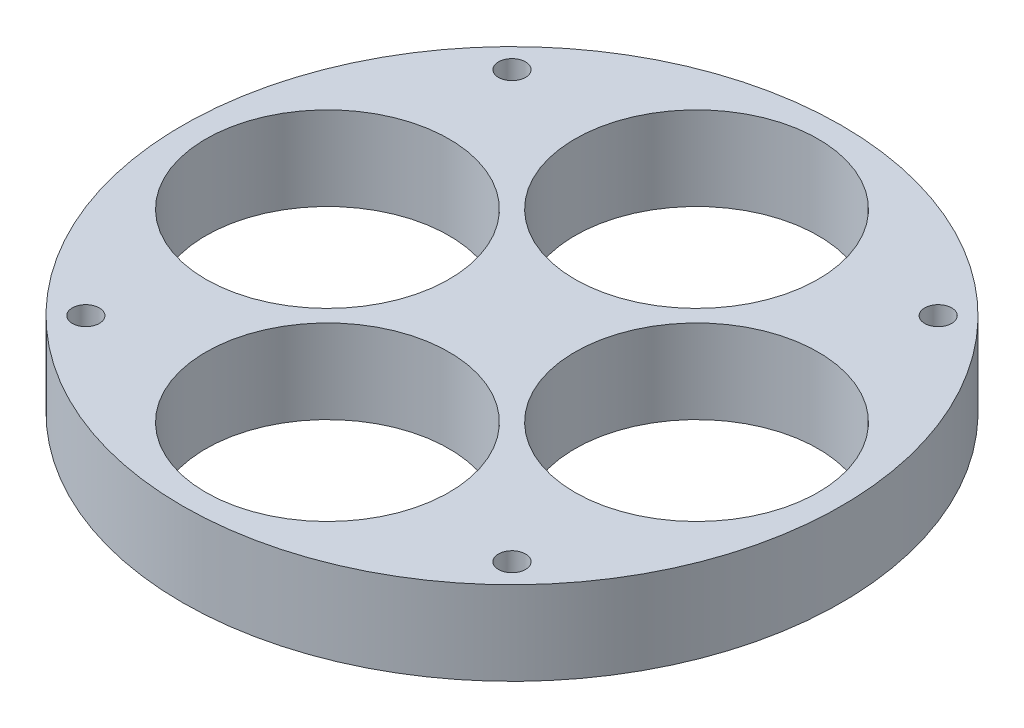
ISO-10303-21;
HEADER;
FILE_DESCRIPTION(('STEP AP214'),'2;1');
FILE_NAME('part.step','',(''),(''),'','','');
FILE_SCHEMA(('AUTOMOTIVE_DESIGN { 1 0 10303 214 1 1 1 1 }'));
ENDSEC;
DATA;
#1=APPLICATION_CONTEXT('core data for automotive mechanical design processes');
#2=APPLICATION_PROTOCOL_DEFINITION('international standard','automotive_design',2000,#1);
#3=PRODUCT_CONTEXT('',#1,'mechanical');
#4=PRODUCT('Part','Part','',(#3));
#5=PRODUCT_RELATED_PRODUCT_CATEGORY('part','',(#4));
#6=PRODUCT_DEFINITION_FORMATION('','',#4);
#7=PRODUCT_DEFINITION_CONTEXT('part definition',#1,'design');
#8=PRODUCT_DEFINITION('design','',#6,#7);
#9=PRODUCT_DEFINITION_SHAPE('','',#8);
#10=(LENGTH_UNIT() NAMED_UNIT(*) SI_UNIT(.MILLI.,.METRE.));
#11=(NAMED_UNIT(*) PLANE_ANGLE_UNIT() SI_UNIT($,.RADIAN.));
#12=(NAMED_UNIT(*) SI_UNIT($,.STERADIAN.) SOLID_ANGLE_UNIT());
#13=UNCERTAINTY_MEASURE_WITH_UNIT(LENGTH_MEASURE(1.E-05),#10,'distance_accuracy_value','');
#14=(GEOMETRIC_REPRESENTATION_CONTEXT(3) GLOBAL_UNCERTAINTY_ASSIGNED_CONTEXT((#13)) GLOBAL_UNIT_ASSIGNED_CONTEXT((#10,
#11,#12)) REPRESENTATION_CONTEXT('',''));
#15=CARTESIAN_POINT('',(0.,0.,0.));
#16=DIRECTION('',(0.,0.,1.));
#17=DIRECTION('',(1.,0.,0.));
#18=AXIS2_PLACEMENT_3D('',#15,#16,#17);
#19=CARTESIAN_POINT('',(16.1644610179254,6.35,16.1644610179245));
#20=DIRECTION('',(0.,-1.,0.));
#21=DIRECTION('',(0.,0.,-1.));
#22=AXIS2_PLACEMENT_3D('',#19,#20,#21);
#23=CYLINDRICAL_SURFACE('',#22,1.02499999999977);
#24=CARTESIAN_POINT('',(16.1644610179254,6.35,16.1644610179245));
#25=DIRECTION('',(0.,1.,0.));
#26=DIRECTION('',(0.,0.,1.));
#27=AXIS2_PLACEMENT_3D('',#24,#25,#26);
#28=CIRCLE('',#27,1.02499999999977);
#29=CARTESIAN_POINT('',(16.1644610179254,6.35,17.1894610179242));
#30=VERTEX_POINT('',#29);
#31=EDGE_CURVE('E41',#30,#30,#28,.T.);
#32=ORIENTED_EDGE('',*,*,#31,.T.);
#33=EDGE_LOOP('',(#32));
#34=FACE_BOUND('',#33,.T.);
#35=CARTESIAN_POINT('',(16.1644610179254,0.,16.1644610179245));
#36=DIRECTION('',(0.,1.,0.));
#37=DIRECTION('',(0.,0.,1.));
#38=AXIS2_PLACEMENT_3D('',#35,#36,#37);
#39=CIRCLE('',#38,1.02499999999977);
#40=CARTESIAN_POINT('',(16.1644610179254,0.,17.1894610179242));
#41=VERTEX_POINT('',#40);
#42=EDGE_CURVE('E70',#41,#41,#39,.T.);
#43=ORIENTED_EDGE('',*,*,#42,.F.);
#44=EDGE_LOOP('',(#43));
#45=FACE_BOUND('',#44,.T.);
#46=ADVANCED_FACE('F33',(#34,#45),#23,.F.);
#47=CARTESIAN_POINT('',(-16.1644610179236,6.35,16.1644610179254));
#48=DIRECTION('',(0.,-1.,0.));
#49=DIRECTION('',(0.,0.,-1.));
#50=AXIS2_PLACEMENT_3D('',#47,#48,#49);
#51=CYLINDRICAL_SURFACE('',#50,1.02500000000068);
#52=CARTESIAN_POINT('',(-16.1644610179236,6.35,16.1644610179254));
#53=DIRECTION('',(0.,1.,0.));
#54=DIRECTION('',(0.,0.,1.));
#55=AXIS2_PLACEMENT_3D('',#52,#53,#54);
#56=CIRCLE('',#55,1.02500000000068);
#57=CARTESIAN_POINT('',(-16.1644610179236,6.35,17.1894610179261));
#58=VERTEX_POINT('',#57);
#59=EDGE_CURVE('E46',#58,#58,#56,.T.);
#60=ORIENTED_EDGE('',*,*,#59,.T.);
#61=EDGE_LOOP('',(#60));
#62=FACE_BOUND('',#61,.T.);
#63=CARTESIAN_POINT('',(-16.1644610179236,0.,16.1644610179254));
#64=DIRECTION('',(0.,1.,0.));
#65=DIRECTION('',(0.,0.,1.));
#66=AXIS2_PLACEMENT_3D('',#63,#64,#65);
#67=CIRCLE('',#66,1.02500000000068);
#68=CARTESIAN_POINT('',(-16.1644610179236,0.,17.1894610179261));
#69=VERTEX_POINT('',#68);
#70=EDGE_CURVE('E68',#69,#69,#67,.T.);
#71=ORIENTED_EDGE('',*,*,#70,.F.);
#72=EDGE_LOOP('',(#71));
#73=FACE_BOUND('',#72,.T.);
#74=ADVANCED_FACE('F100',(#62,#73),#51,.F.);
#75=CARTESIAN_POINT('',(-16.1644610179245,6.35,-16.1644610179236));
#76=DIRECTION('',(0.,-1.,0.));
#77=DIRECTION('',(0.,0.,-1.));
#78=AXIS2_PLACEMENT_3D('',#75,#76,#77);
#79=CYLINDRICAL_SURFACE('',#78,1.02500000000097);
#80=CARTESIAN_POINT('',(-16.1644610179245,6.35,-16.1644610179236));
#81=DIRECTION('',(0.,1.,0.));
#82=DIRECTION('',(0.,0.,1.));
#83=AXIS2_PLACEMENT_3D('',#80,#81,#82);
#84=CIRCLE('',#83,1.02500000000097);
#85=CARTESIAN_POINT('',(-16.1644610179245,6.35,-15.1394610179226));
#86=VERTEX_POINT('',#85);
#87=EDGE_CURVE('E95',#86,#86,#84,.T.);
#88=ORIENTED_EDGE('',*,*,#87,.T.);
#89=EDGE_LOOP('',(#88));
#90=FACE_BOUND('',#89,.T.);
#91=CARTESIAN_POINT('',(-16.1644610179245,0.,-16.1644610179236));
#92=DIRECTION('',(0.,1.,0.));
#93=DIRECTION('',(0.,0.,1.));
#94=AXIS2_PLACEMENT_3D('',#91,#92,#93);
#95=CIRCLE('',#94,1.02500000000097);
#96=CARTESIAN_POINT('',(-16.1644610179245,0.,-15.1394610179226));
#97=VERTEX_POINT('',#96);
#98=EDGE_CURVE('E65',#97,#97,#95,.T.);
#99=ORIENTED_EDGE('',*,*,#98,.F.);
#100=EDGE_LOOP('',(#99));
#101=FACE_BOUND('',#100,.T.);
#102=ADVANCED_FACE('F118',(#90,#101),#79,.F.);
#103=CARTESIAN_POINT('',(0.,6.35,14.));
#104=DIRECTION('',(0.,-1.,0.));
#105=DIRECTION('',(0.,0.,-1.));
#106=AXIS2_PLACEMENT_3D('',#103,#104,#105);
#107=CYLINDRICAL_SURFACE('',#106,9.22500000000001);
#108=CARTESIAN_POINT('',(0.,6.35,14.));
#109=DIRECTION('',(0.,1.,0.));
#110=DIRECTION('',(0.,0.,1.));
#111=AXIS2_PLACEMENT_3D('',#108,#109,#110);
#112=CIRCLE('',#111,9.22500000000001);
#113=CARTESIAN_POINT('',(0.,6.35,23.225));
#114=VERTEX_POINT('',#113);
#115=EDGE_CURVE('E92',#114,#114,#112,.T.);
#116=ORIENTED_EDGE('',*,*,#115,.T.);
#117=EDGE_LOOP('',(#116));
#118=FACE_BOUND('',#117,.T.);
#119=CARTESIAN_POINT('',(0.,0.,14.));
#120=DIRECTION('',(0.,1.,0.));
#121=DIRECTION('',(0.,0.,1.));
#122=AXIS2_PLACEMENT_3D('',#119,#120,#121);
#123=CIRCLE('',#122,9.22500000000001);
#124=CARTESIAN_POINT('',(0.,0.,23.225));
#125=VERTEX_POINT('',#124);
#126=EDGE_CURVE('E62',#125,#125,#123,.T.);
#127=ORIENTED_EDGE('',*,*,#126,.F.);
#128=EDGE_LOOP('',(#127));
#129=FACE_BOUND('',#128,.T.);
#130=ADVANCED_FACE('F125',(#118,#129),#107,.F.);
#131=CARTESIAN_POINT('',(-14.,6.35,0.));
#132=DIRECTION('',(0.,-1.,0.));
#133=DIRECTION('',(0.,0.,-1.));
#134=AXIS2_PLACEMENT_3D('',#131,#132,#133);
#135=CYLINDRICAL_SURFACE('',#134,9.22500000000001);
#136=CARTESIAN_POINT('',(-14.,6.35,0.));
#137=DIRECTION('',(0.,1.,0.));
#138=DIRECTION('',(0.,0.,1.));
#139=AXIS2_PLACEMENT_3D('',#136,#137,#138);
#140=CIRCLE('',#139,9.22500000000001);
#141=CARTESIAN_POINT('',(-14.,6.35,9.22499999999991));
#142=VERTEX_POINT('',#141);
#143=EDGE_CURVE('E89',#142,#142,#140,.T.);
#144=ORIENTED_EDGE('',*,*,#143,.T.);
#145=EDGE_LOOP('',(#144));
#146=FACE_BOUND('',#145,.T.);
#147=CARTESIAN_POINT('',(-14.,0.,0.));
#148=DIRECTION('',(0.,1.,0.));
#149=DIRECTION('',(0.,0.,1.));
#150=AXIS2_PLACEMENT_3D('',#147,#148,#149);
#151=CIRCLE('',#150,9.22500000000001);
#152=CARTESIAN_POINT('',(-14.,0.,9.22499999999991));
#153=VERTEX_POINT('',#152);
#154=EDGE_CURVE('E59',#153,#153,#151,.T.);
#155=ORIENTED_EDGE('',*,*,#154,.F.);
#156=EDGE_LOOP('',(#155));
#157=FACE_BOUND('',#156,.T.);
#158=ADVANCED_FACE('F129',(#146,#157),#135,.F.);
#159=CARTESIAN_POINT('',(1.46642216231412E-13,6.35,-14.));
#160=DIRECTION('',(0.,-1.,0.));
#161=DIRECTION('',(0.,0.,-1.));
#162=AXIS2_PLACEMENT_3D('',#159,#160,#161);
#163=CYLINDRICAL_SURFACE('',#162,9.22500000000001);
#164=CARTESIAN_POINT('',(1.46642216231412E-13,6.35,-14.));
#165=DIRECTION('',(0.,1.,0.));
#166=DIRECTION('',(0.,0.,1.));
#167=AXIS2_PLACEMENT_3D('',#164,#165,#166);
#168=CIRCLE('',#167,9.22500000000001);
#169=CARTESIAN_POINT('',(1.46642216231412E-13,6.35,-4.77499999999999));
#170=VERTEX_POINT('',#169);
#171=EDGE_CURVE('E84',#170,#170,#168,.T.);
#172=ORIENTED_EDGE('',*,*,#171,.T.);
#173=EDGE_LOOP('',(#172));
#174=FACE_BOUND('',#173,.T.);
#175=CARTESIAN_POINT('',(1.46642216231412E-13,0.,-14.));
#176=DIRECTION('',(0.,1.,0.));
#177=DIRECTION('',(0.,0.,1.));
#178=AXIS2_PLACEMENT_3D('',#175,#176,#177);
#179=CIRCLE('',#178,9.22500000000001);
#180=CARTESIAN_POINT('',(1.46642216231412E-13,0.,-4.77499999999999));
#181=VERTEX_POINT('',#180);
#182=EDGE_CURVE('E56',#181,#181,#179,.T.);
#183=ORIENTED_EDGE('',*,*,#182,.F.);
#184=EDGE_LOOP('',(#183));
#185=FACE_BOUND('',#184,.T.);
#186=ADVANCED_FACE('F133',(#174,#185),#163,.F.);
#187=CARTESIAN_POINT('',(16.1644610179245,6.35,-16.1644610179245));
#188=DIRECTION('',(0.,-1.,0.));
#189=DIRECTION('',(0.,0.,-1.));
#190=AXIS2_PLACEMENT_3D('',#187,#188,#189);
#191=CYLINDRICAL_SURFACE('',#190,1.025);
#192=CARTESIAN_POINT('',(16.1644610179245,6.35,-16.1644610179245));
#193=DIRECTION('',(0.,1.,0.));
#194=DIRECTION('',(0.,0.,1.));
#195=AXIS2_PLACEMENT_3D('',#192,#193,#194);
#196=CIRCLE('',#195,1.025);
#197=CARTESIAN_POINT('',(16.1644610179245,6.35,-15.1394610179245));
#198=VERTEX_POINT('',#197);
#199=EDGE_CURVE('E79',#198,#198,#196,.T.);
#200=ORIENTED_EDGE('',*,*,#199,.T.);
#201=EDGE_LOOP('',(#200));
#202=FACE_BOUND('',#201,.T.);
#203=CARTESIAN_POINT('',(16.1644610179245,0.,-16.1644610179245));
#204=DIRECTION('',(0.,1.,0.));
#205=DIRECTION('',(0.,0.,1.));
#206=AXIS2_PLACEMENT_3D('',#203,#204,#205);
#207=CIRCLE('',#206,1.025);
#208=CARTESIAN_POINT('',(16.1644610179245,0.,-15.1394610179245));
#209=VERTEX_POINT('',#208);
#210=EDGE_CURVE('E53',#209,#209,#207,.T.);
#211=ORIENTED_EDGE('',*,*,#210,.F.);
#212=EDGE_LOOP('',(#211));
#213=FACE_BOUND('',#212,.T.);
#214=ADVANCED_FACE('F136',(#202,#213),#191,.F.);
#215=CARTESIAN_POINT('',(14.,6.35,0.));
#216=DIRECTION('',(0.,-1.,0.));
#217=DIRECTION('',(0.,0.,-1.));
#218=AXIS2_PLACEMENT_3D('',#215,#216,#217);
#219=CYLINDRICAL_SURFACE('',#218,9.22500000000001);
#220=CARTESIAN_POINT('',(14.,6.35,0.));
#221=DIRECTION('',(0.,1.,0.));
#222=DIRECTION('',(0.,0.,1.));
#223=AXIS2_PLACEMENT_3D('',#220,#221,#222);
#224=CIRCLE('',#223,9.22500000000001);
#225=CARTESIAN_POINT('',(14.,6.35,9.22500000000001));
#226=VERTEX_POINT('',#225);
#227=EDGE_CURVE('E75',#226,#226,#224,.T.);
#228=ORIENTED_EDGE('',*,*,#227,.T.);
#229=EDGE_LOOP('',(#228));
#230=FACE_BOUND('',#229,.T.);
#231=CARTESIAN_POINT('',(14.,0.,0.));
#232=DIRECTION('',(0.,1.,0.));
#233=DIRECTION('',(0.,0.,1.));
#234=AXIS2_PLACEMENT_3D('',#231,#232,#233);
#235=CIRCLE('',#234,9.22500000000001);
#236=CARTESIAN_POINT('',(14.,0.,9.22500000000001));
#237=VERTEX_POINT('',#236);
#238=EDGE_CURVE('E50',#237,#237,#235,.T.);
#239=ORIENTED_EDGE('',*,*,#238,.F.);
#240=EDGE_LOOP('',(#239));
#241=FACE_BOUND('',#240,.T.);
#242=ADVANCED_FACE('F35',(#230,#241),#219,.F.);
#243=CARTESIAN_POINT('',(0.,6.35,0.));
#244=DIRECTION('',(0.,-1.,0.));
#245=DIRECTION('',(0.,0.,-1.));
#246=AXIS2_PLACEMENT_3D('',#243,#244,#245);
#247=CYLINDRICAL_SURFACE('',#246,25.);
#248=CARTESIAN_POINT('',(0.,6.35,0.));
#249=DIRECTION('',(0.,1.,0.));
#250=DIRECTION('',(0.,0.,1.));
#251=AXIS2_PLACEMENT_3D('',#248,#249,#250);
#252=CIRCLE('',#251,25.);
#253=CARTESIAN_POINT('',(0.,6.35,25.));
#254=VERTEX_POINT('',#253);
#255=EDGE_CURVE('E10',#254,#254,#252,.T.);
#256=ORIENTED_EDGE('',*,*,#255,.F.);
#257=EDGE_LOOP('',(#256));
#258=FACE_BOUND('',#257,.T.);
#259=CARTESIAN_POINT('',(0.,0.,0.));
#260=DIRECTION('',(0.,1.,0.));
#261=DIRECTION('',(0.,0.,1.));
#262=AXIS2_PLACEMENT_3D('',#259,#260,#261);
#263=CIRCLE('',#262,25.);
#264=CARTESIAN_POINT('',(0.,0.,25.));
#265=VERTEX_POINT('',#264);
#266=EDGE_CURVE('E37',#265,#265,#263,.T.);
#267=ORIENTED_EDGE('',*,*,#266,.T.);
#268=EDGE_LOOP('',(#267));
#269=FACE_BOUND('',#268,.T.);
#270=ADVANCED_FACE('F107',(#258,#269),#247,.T.);
#271=CARTESIAN_POINT('',(0.,6.35,0.));
#272=DIRECTION('',(0.,1.,0.));
#273=DIRECTION('',(0.,0.,1.));
#274=AXIS2_PLACEMENT_3D('',#271,#272,#273);
#275=PLANE('',#274);
#276=ORIENTED_EDGE('',*,*,#227,.F.);
#277=EDGE_LOOP('',(#276));
#278=FACE_BOUND('',#277,.T.);
#279=ORIENTED_EDGE('',*,*,#199,.F.);
#280=EDGE_LOOP('',(#279));
#281=FACE_BOUND('',#280,.T.);
#282=ORIENTED_EDGE('',*,*,#171,.F.);
#283=EDGE_LOOP('',(#282));
#284=FACE_BOUND('',#283,.T.);
#285=ORIENTED_EDGE('',*,*,#143,.F.);
#286=EDGE_LOOP('',(#285));
#287=FACE_BOUND('',#286,.T.);
#288=ORIENTED_EDGE('',*,*,#115,.F.);
#289=EDGE_LOOP('',(#288));
#290=FACE_BOUND('',#289,.T.);
#291=ORIENTED_EDGE('',*,*,#87,.F.);
#292=EDGE_LOOP('',(#291));
#293=FACE_BOUND('',#292,.T.);
#294=ORIENTED_EDGE('',*,*,#59,.F.);
#295=EDGE_LOOP('',(#294));
#296=FACE_BOUND('',#295,.T.);
#297=ORIENTED_EDGE('',*,*,#31,.F.);
#298=EDGE_LOOP('',(#297));
#299=FACE_BOUND('',#298,.T.);
#300=ORIENTED_EDGE('',*,*,#255,.T.);
#301=EDGE_LOOP('',(#300));
#302=FACE_BOUND('',#301,.T.);
#303=ADVANCED_FACE('F103',(#278,#281,#284,#287,#290,#293,#296,#299,#302),#275,.T.);
#304=CARTESIAN_POINT('',(0.,0.,0.));
#305=DIRECTION('',(0.,1.,0.));
#306=DIRECTION('',(0.,0.,1.));
#307=AXIS2_PLACEMENT_3D('',#304,#305,#306);
#308=PLANE('',#307);
#309=ORIENTED_EDGE('',*,*,#238,.T.);
#310=EDGE_LOOP('',(#309));
#311=FACE_BOUND('',#310,.T.);
#312=ORIENTED_EDGE('',*,*,#210,.T.);
#313=EDGE_LOOP('',(#312));
#314=FACE_BOUND('',#313,.T.);
#315=ORIENTED_EDGE('',*,*,#182,.T.);
#316=EDGE_LOOP('',(#315));
#317=FACE_BOUND('',#316,.T.);
#318=ORIENTED_EDGE('',*,*,#154,.T.);
#319=EDGE_LOOP('',(#318));
#320=FACE_BOUND('',#319,.T.);
#321=ORIENTED_EDGE('',*,*,#126,.T.);
#322=EDGE_LOOP('',(#321));
#323=FACE_BOUND('',#322,.T.);
#324=ORIENTED_EDGE('',*,*,#98,.T.);
#325=EDGE_LOOP('',(#324));
#326=FACE_BOUND('',#325,.T.);
#327=ORIENTED_EDGE('',*,*,#70,.T.);
#328=EDGE_LOOP('',(#327));
#329=FACE_BOUND('',#328,.T.);
#330=ORIENTED_EDGE('',*,*,#42,.T.);
#331=EDGE_LOOP('',(#330));
#332=FACE_BOUND('',#331,.T.);
#333=ORIENTED_EDGE('',*,*,#266,.F.);
#334=EDGE_LOOP('',(#333));
#335=FACE_BOUND('',#334,.T.);
#336=ADVANCED_FACE('F106',(#311,#314,#317,#320,#323,#326,#329,#332,#335),#308,.F.);
#337=CLOSED_SHELL('',(#46,#74,#102,#130,#158,#186,#214,#242,#270,#303,#336));
#338=MANIFOLD_SOLID_BREP('B2',#337);
#339=ADVANCED_BREP_SHAPE_REPRESENTATION('',(#18,#338),#14);
#340=SHAPE_DEFINITION_REPRESENTATION(#9,#339);
ENDSEC;
END-ISO-10303-21;
